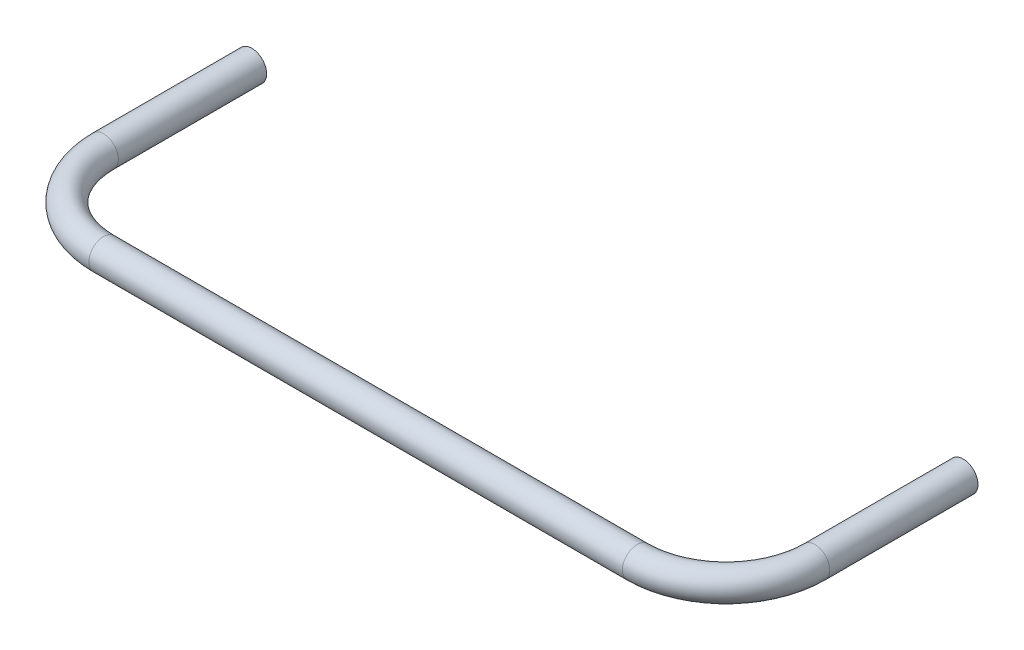
ISO-10303-21;
HEADER;
FILE_DESCRIPTION(('STEP AP214'),'2;1');
FILE_NAME('part.step','',(''),(''),'','','');
FILE_SCHEMA(('AUTOMOTIVE_DESIGN { 1 0 10303 214 1 1 1 1 }'));
ENDSEC;
DATA;
#1=APPLICATION_CONTEXT('core data for automotive mechanical design processes');
#2=APPLICATION_PROTOCOL_DEFINITION('international standard','automotive_design',2000,#1);
#3=PRODUCT_CONTEXT('',#1,'mechanical');
#4=PRODUCT('Part','Part','',(#3));
#5=PRODUCT_RELATED_PRODUCT_CATEGORY('part','',(#4));
#6=PRODUCT_DEFINITION_FORMATION('','',#4);
#7=PRODUCT_DEFINITION_CONTEXT('part definition',#1,'design');
#8=PRODUCT_DEFINITION('design','',#6,#7);
#9=PRODUCT_DEFINITION_SHAPE('','',#8);
#10=(LENGTH_UNIT() NAMED_UNIT(*) SI_UNIT(.MILLI.,.METRE.));
#11=(NAMED_UNIT(*) PLANE_ANGLE_UNIT() SI_UNIT($,.RADIAN.));
#12=(NAMED_UNIT(*) SI_UNIT($,.STERADIAN.) SOLID_ANGLE_UNIT());
#13=UNCERTAINTY_MEASURE_WITH_UNIT(LENGTH_MEASURE(1.E-05),#10,'distance_accuracy_value','');
#14=(GEOMETRIC_REPRESENTATION_CONTEXT(3) GLOBAL_UNCERTAINTY_ASSIGNED_CONTEXT((#13)) GLOBAL_UNIT_ASSIGNED_CONTEXT((#10,
#11,#12)) REPRESENTATION_CONTEXT('',''));
#15=CARTESIAN_POINT('',(0.,0.,0.));
#16=DIRECTION('',(0.,0.,1.));
#17=DIRECTION('',(1.,0.,0.));
#18=AXIS2_PLACEMENT_3D('',#15,#16,#17);
#19=CARTESIAN_POINT('',(152.4,0.,-101.6));
#20=DIRECTION('',(0.,0.,-1.));
#21=DIRECTION('',(-1.,0.,0.));
#22=AXIS2_PLACEMENT_3D('',#19,#20,#21);
#23=PLANE('',#22);
#24=CARTESIAN_POINT('',(152.4,0.,-101.6));
#25=DIRECTION('',(0.,0.,-1.));
#26=DIRECTION('',(-1.,0.,0.));
#27=AXIS2_PLACEMENT_3D('',#24,#25,#26);
#28=CIRCLE('',#27,6.34999999999999);
#29=CARTESIAN_POINT('',(146.05,0.,-101.6));
#30=VERTEX_POINT('',#29);
#31=EDGE_CURVE('E69',#30,#30,#28,.T.);
#32=ORIENTED_EDGE('',*,*,#31,.T.);
#33=EDGE_LOOP('',(#32));
#34=FACE_BOUND('',#33,.T.);
#35=ADVANCED_FACE('F47',(#34),#23,.T.);
#36=CARTESIAN_POINT('',(-152.4,0.,-101.6));
#37=DIRECTION('',(0.,0.,1.));
#38=DIRECTION('',(1.,0.,0.));
#39=AXIS2_PLACEMENT_3D('',#36,#37,#38);
#40=PLANE('',#39);
#41=CARTESIAN_POINT('',(-152.4,0.,-101.6));
#42=DIRECTION('',(0.,0.,1.));
#43=DIRECTION('',(1.,0.,0.));
#44=AXIS2_PLACEMENT_3D('',#41,#42,#43);
#45=CIRCLE('',#44,6.34999999999999);
#46=CARTESIAN_POINT('',(-146.05,0.,-101.6));
#47=VERTEX_POINT('',#46);
#48=EDGE_CURVE('E11',#47,#47,#45,.T.);
#49=ORIENTED_EDGE('',*,*,#48,.F.);
#50=EDGE_LOOP('',(#49));
#51=FACE_BOUND('',#50,.T.);
#52=ADVANCED_FACE('F77',(#51),#40,.F.);
#53=CARTESIAN_POINT('',(152.4,0.,-101.6));
#54=DIRECTION('',(0.,0.,1.));
#55=DIRECTION('',(1.,0.,0.));
#56=AXIS2_PLACEMENT_3D('',#53,#54,#55);
#57=CYLINDRICAL_SURFACE('',#56,6.34999999999999);
#58=CARTESIAN_POINT('',(152.4,0.,-38.1));
#59=DIRECTION('',(0.,0.,-1.));
#60=DIRECTION('',(-1.,0.,0.));
#61=AXIS2_PLACEMENT_3D('',#58,#59,#60);
#62=CIRCLE('',#61,6.34999999999999);
#63=CARTESIAN_POINT('',(158.75,0.,-38.1));
#64=VERTEX_POINT('',#63);
#65=EDGE_CURVE('E66',#64,#64,#62,.T.);
#66=ORIENTED_EDGE('',*,*,#65,.T.);
#67=EDGE_LOOP('',(#66));
#68=FACE_BOUND('',#67,.T.);
#69=ORIENTED_EDGE('',*,*,#31,.F.);
#70=EDGE_LOOP('',(#69));
#71=FACE_BOUND('',#70,.T.);
#72=ADVANCED_FACE('F74',(#68,#71),#57,.T.);
#73=CARTESIAN_POINT('',(114.3,0.,-38.1));
#74=DIRECTION('',(0.,-1.,0.));
#75=DIRECTION('',(0.,0.,-1.));
#76=AXIS2_PLACEMENT_3D('',#73,#74,#75);
#77=TOROIDAL_SURFACE('',#76,38.1,6.34999999999999);
#78=CARTESIAN_POINT('',(114.3,0.,0.));
#79=DIRECTION('',(1.,0.,0.));
#80=DIRECTION('',(0.,0.,-1.));
#81=AXIS2_PLACEMENT_3D('',#78,#79,#80);
#82=CIRCLE('',#81,6.34999999999999);
#83=CARTESIAN_POINT('',(114.3,0.,6.34999999999996));
#84=VERTEX_POINT('',#83);
#85=EDGE_CURVE('E61',#84,#84,#82,.T.);
#86=CARTESIAN_POINT('',(114.3,0.,-38.1));
#87=DIRECTION('',(0.,-1.,0.));
#88=DIRECTION('',(0.,0.,-1.));
#89=AXIS2_PLACEMENT_3D('',#86,#87,#88);
#90=CIRCLE('',#89,44.45);
#91=EDGE_CURVE('',#64,#84,#90,.T.);
#92=ORIENTED_EDGE('',*,*,#65,.F.);
#93=ORIENTED_EDGE('',*,*,#85,.T.);
#94=ORIENTED_EDGE('',*,*,#91,.T.);
#95=ORIENTED_EDGE('',*,*,#91,.F.);
#96=EDGE_LOOP('',(#92,#94,#93,#95));
#97=FACE_BOUND('',#96,.T.);
#98=ADVANCED_FACE('F76',(#97),#77,.T.);
#99=CARTESIAN_POINT('',(114.3,0.,0.));
#100=DIRECTION('',(-1.,0.,0.));
#101=DIRECTION('',(0.,0.,1.));
#102=AXIS2_PLACEMENT_3D('',#99,#100,#101);
#103=CYLINDRICAL_SURFACE('',#102,6.34999999999999);
#104=CARTESIAN_POINT('',(-114.3,0.,0.));
#105=DIRECTION('',(1.,0.,0.));
#106=DIRECTION('',(0.,0.,-1.));
#107=AXIS2_PLACEMENT_3D('',#104,#105,#106);
#108=CIRCLE('',#107,6.34999999999999);
#109=CARTESIAN_POINT('',(-114.3,0.,6.34999999999996));
#110=VERTEX_POINT('',#109);
#111=EDGE_CURVE('E57',#110,#110,#108,.T.);
#112=ORIENTED_EDGE('',*,*,#111,.T.);
#113=EDGE_LOOP('',(#112));
#114=FACE_BOUND('',#113,.T.);
#115=ORIENTED_EDGE('',*,*,#85,.F.);
#116=EDGE_LOOP('',(#115));
#117=FACE_BOUND('',#116,.T.);
#118=ADVANCED_FACE('F84',(#114,#117),#103,.T.);
#119=CARTESIAN_POINT('',(-114.3,0.,-38.1));
#120=DIRECTION('',(0.,-1.,0.));
#121=DIRECTION('',(0.,0.,-1.));
#122=AXIS2_PLACEMENT_3D('',#119,#120,#121);
#123=TOROIDAL_SURFACE('',#122,38.1,6.34999999999999);
#124=CARTESIAN_POINT('',(-152.4,0.,-38.0999999999999));
#125=DIRECTION('',(0.,0.,1.));
#126=DIRECTION('',(1.,0.,0.));
#127=AXIS2_PLACEMENT_3D('',#124,#125,#126);
#128=CIRCLE('',#127,6.34999999999999);
#129=CARTESIAN_POINT('',(-158.75,0.,-38.0999999999999));
#130=VERTEX_POINT('',#129);
#131=EDGE_CURVE('E53',#130,#130,#128,.T.);
#132=CARTESIAN_POINT('',(-114.3,0.,-38.1));
#133=DIRECTION('',(0.,-1.,0.));
#134=DIRECTION('',(0.,0.,-1.));
#135=AXIS2_PLACEMENT_3D('',#132,#133,#134);
#136=CIRCLE('',#135,44.45);
#137=EDGE_CURVE('',#110,#130,#136,.T.);
#138=ORIENTED_EDGE('',*,*,#111,.F.);
#139=ORIENTED_EDGE('',*,*,#131,.T.);
#140=ORIENTED_EDGE('',*,*,#137,.T.);
#141=ORIENTED_EDGE('',*,*,#137,.F.);
#142=EDGE_LOOP('',(#138,#140,#139,#141));
#143=FACE_BOUND('',#142,.T.);
#144=ADVANCED_FACE('F90',(#143),#123,.T.);
#145=CARTESIAN_POINT('',(-152.4,0.,-38.1));
#146=DIRECTION('',(0.,0.,-1.));
#147=DIRECTION('',(-1.,0.,0.));
#148=AXIS2_PLACEMENT_3D('',#145,#146,#147);
#149=CYLINDRICAL_SURFACE('',#148,6.34999999999999);
#150=ORIENTED_EDGE('',*,*,#48,.T.);
#151=EDGE_LOOP('',(#150));
#152=FACE_BOUND('',#151,.T.);
#153=ORIENTED_EDGE('',*,*,#131,.F.);
#154=EDGE_LOOP('',(#153));
#155=FACE_BOUND('',#154,.T.);
#156=ADVANCED_FACE('F88',(#152,#155),#149,.T.);
#157=CLOSED_SHELL('',(#35,#52,#72,#98,#118,#144,#156));
#158=MANIFOLD_SOLID_BREP('B2',#157);
#159=ADVANCED_BREP_SHAPE_REPRESENTATION('',(#18,#158),#14);
#160=SHAPE_DEFINITION_REPRESENTATION(#9,#159);
ENDSEC;
END-ISO-10303-21;
